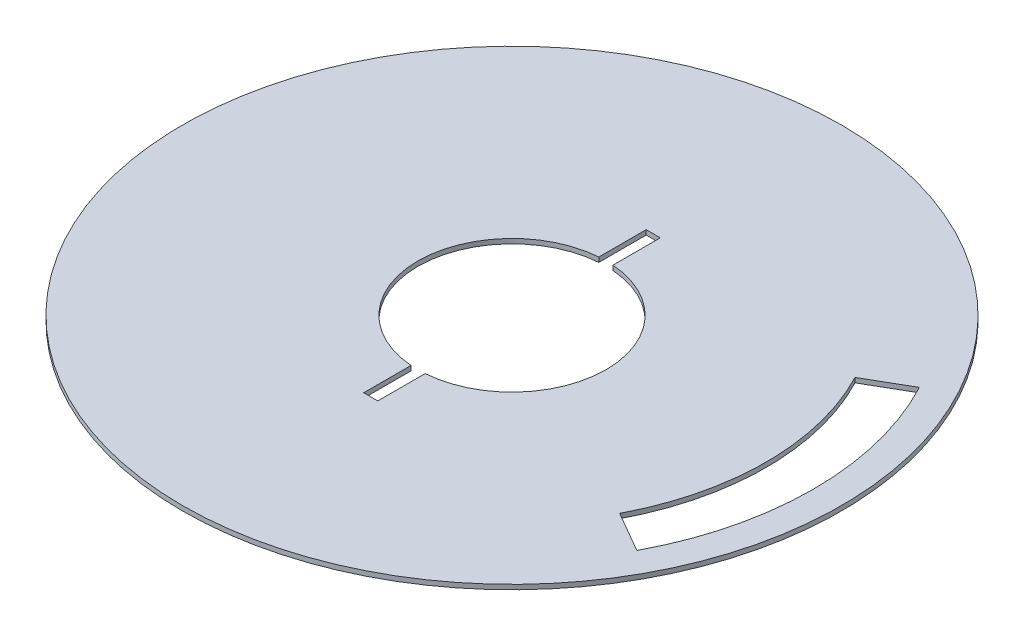
ISO-10303-21;
HEADER;
FILE_DESCRIPTION(('STEP AP214'),'2;1');
FILE_NAME('part.step','',(''),(''),'','','');
FILE_SCHEMA(('AUTOMOTIVE_DESIGN { 1 0 10303 214 1 1 1 1 }'));
ENDSEC;
DATA;
#1=APPLICATION_CONTEXT('core data for automotive mechanical design processes');
#2=APPLICATION_PROTOCOL_DEFINITION('international standard','automotive_design',2000,#1);
#3=PRODUCT_CONTEXT('',#1,'mechanical');
#4=PRODUCT('Part','Part','',(#3));
#5=PRODUCT_RELATED_PRODUCT_CATEGORY('part','',(#4));
#6=PRODUCT_DEFINITION_FORMATION('','',#4);
#7=PRODUCT_DEFINITION_CONTEXT('part definition',#1,'design');
#8=PRODUCT_DEFINITION('design','',#6,#7);
#9=PRODUCT_DEFINITION_SHAPE('','',#8);
#10=(LENGTH_UNIT() NAMED_UNIT(*) SI_UNIT(.MILLI.,.METRE.));
#11=(NAMED_UNIT(*) PLANE_ANGLE_UNIT() SI_UNIT($,.RADIAN.));
#12=(NAMED_UNIT(*) SI_UNIT($,.STERADIAN.) SOLID_ANGLE_UNIT());
#13=UNCERTAINTY_MEASURE_WITH_UNIT(LENGTH_MEASURE(1.E-05),#10,'distance_accuracy_value','');
#14=(GEOMETRIC_REPRESENTATION_CONTEXT(3) GLOBAL_UNCERTAINTY_ASSIGNED_CONTEXT((#13)) GLOBAL_UNIT_ASSIGNED_CONTEXT((#10,
#11,#12)) REPRESENTATION_CONTEXT('',''));
#15=CARTESIAN_POINT('',(0.,0.,0.));
#16=DIRECTION('',(0.,0.,1.));
#17=DIRECTION('',(1.,0.,0.));
#18=AXIS2_PLACEMENT_3D('',#15,#16,#17);
#19=CARTESIAN_POINT('',(0.,5.,0.));
#20=DIRECTION('',(0.,-1.,0.));
#21=DIRECTION('',(0.,0.,-1.));
#22=AXIS2_PLACEMENT_3D('',#19,#20,#21);
#23=CYLINDRICAL_SURFACE('',#22,270.);
#24=CARTESIAN_POINT('',(0.,0.,0.));
#25=DIRECTION('',(0.,1.,0.));
#26=DIRECTION('',(0.,0.,1.));
#27=AXIS2_PLACEMENT_3D('',#24,#25,#26);
#28=CIRCLE('',#27,270.);
#29=CARTESIAN_POINT('',(239.321958875486,0.,-125.));
#30=VERTEX_POINT('',#29);
#31=CARTESIAN_POINT('',(239.321958875486,0.,125.));
#32=VERTEX_POINT('',#31);
#33=EDGE_CURVE('E185',#30,#32,#28,.F.);
#34=ORIENTED_EDGE('',*,*,#33,.F.);
#35=DIRECTION('',(0.,-1.,0.));
#36=VECTOR('',#35,1.);
#37=CARTESIAN_POINT('',(239.321958875486,5.,-125.));
#38=LINE('',#37,#36);
#39=CARTESIAN_POINT('',(239.321958875486,5.,-125.));
#40=VERTEX_POINT('',#39);
#41=EDGE_CURVE('E11',#40,#30,#38,.T.);
#42=ORIENTED_EDGE('',*,*,#41,.F.);
#43=CARTESIAN_POINT('',(0.,5.,0.));
#44=DIRECTION('',(0.,1.,0.));
#45=DIRECTION('',(0.,0.,1.));
#46=AXIS2_PLACEMENT_3D('',#43,#44,#45);
#47=CIRCLE('',#46,270.);
#48=CARTESIAN_POINT('',(239.321958875486,5.,125.));
#49=VERTEX_POINT('',#48);
#50=EDGE_CURVE('E143',#40,#49,#47,.F.);
#51=ORIENTED_EDGE('',*,*,#50,.T.);
#52=DIRECTION('',(0.,-1.,0.));
#53=VECTOR('',#52,1.);
#54=CARTESIAN_POINT('',(239.321958875486,5.,125.));
#55=LINE('',#54,#53);
#56=EDGE_CURVE('E52',#49,#32,#55,.T.);
#57=ORIENTED_EDGE('',*,*,#56,.T.);
#58=EDGE_LOOP('',(#34,#42,#51,#57));
#59=FACE_BOUND('',#58,.T.);
#60=ADVANCED_FACE('F33',(#59),#23,.T.);
#61=CARTESIAN_POINT('',(5.7039019823442,5.,9.879448034813));
#62=DIRECTION('',(-0.5,0.,-0.866025403784439));
#63=DIRECTION('',(-0.866025403784439,0.,0.5));
#64=AXIS2_PLACEMENT_3D('',#61,#62,#63);
#65=PLANE('',#64);
#66=DIRECTION('',(0.866025403784439,0.,-0.5));
#67=VECTOR('',#66,1.);
#68=CARTESIAN_POINT('',(5.7039019823442,0.,9.879448034813));
#69=LINE('',#68,#67);
#70=CARTESIAN_POINT('',(282.655877072842,0.,-150.018849336284));
#71=VERTEX_POINT('',#70);
#72=EDGE_CURVE('E148',#30,#71,#69,.T.);
#73=ORIENTED_EDGE('',*,*,#72,.T.);
#74=DIRECTION('',(0.,-1.,0.));
#75=VECTOR('',#74,1.);
#76=CARTESIAN_POINT('',(282.655877072842,5.,-150.018849336284));
#77=LINE('',#76,#75);
#78=CARTESIAN_POINT('',(282.655877072842,5.,-150.018849336284));
#79=VERTEX_POINT('',#78);
#80=EDGE_CURVE('E43',#79,#71,#77,.T.);
#81=ORIENTED_EDGE('',*,*,#80,.F.);
#82=DIRECTION('',(0.866025403784439,0.,-0.5));
#83=VECTOR('',#82,1.);
#84=CARTESIAN_POINT('',(5.7039019823442,5.,9.879448034813));
#85=LINE('',#84,#83);
#86=EDGE_CURVE('E137',#40,#79,#85,.T.);
#87=ORIENTED_EDGE('',*,*,#86,.F.);
#88=ORIENTED_EDGE('',*,*,#41,.T.);
#89=EDGE_LOOP('',(#73,#81,#87,#88));
#90=FACE_BOUND('',#89,.T.);
#91=ADVANCED_FACE('F146',(#90),#65,.F.);
#92=CARTESIAN_POINT('',(0.,5.,0.));
#93=DIRECTION('',(0.,-1.,0.));
#94=DIRECTION('',(0.,0.,-1.));
#95=AXIS2_PLACEMENT_3D('',#92,#93,#94);
#96=CYLINDRICAL_SURFACE('',#95,320.);
#97=CARTESIAN_POINT('',(0.,0.,0.));
#98=DIRECTION('',(0.,1.,0.));
#99=DIRECTION('',(0.,0.,1.));
#100=AXIS2_PLACEMENT_3D('',#97,#98,#99);
#101=CIRCLE('',#100,320.);
#102=CARTESIAN_POINT('',(282.655877072841,0.,150.018849336284));
#103=VERTEX_POINT('',#102);
#104=EDGE_CURVE('E182',#71,#103,#101,.F.);
#105=ORIENTED_EDGE('',*,*,#104,.T.);
#106=DIRECTION('',(0.,-1.,0.));
#107=VECTOR('',#106,1.);
#108=CARTESIAN_POINT('',(282.655877072841,5.,150.018849336284));
#109=LINE('',#108,#107);
#110=CARTESIAN_POINT('',(282.655877072841,5.,150.018849336284));
#111=VERTEX_POINT('',#110);
#112=EDGE_CURVE('E90',#111,#103,#109,.T.);
#113=ORIENTED_EDGE('',*,*,#112,.F.);
#114=CARTESIAN_POINT('',(0.,5.,0.));
#115=DIRECTION('',(0.,1.,0.));
#116=DIRECTION('',(0.,0.,1.));
#117=AXIS2_PLACEMENT_3D('',#114,#115,#116);
#118=CIRCLE('',#117,320.);
#119=EDGE_CURVE('E129',#79,#111,#118,.F.);
#120=ORIENTED_EDGE('',*,*,#119,.F.);
#121=ORIENTED_EDGE('',*,*,#80,.T.);
#122=EDGE_LOOP('',(#105,#113,#120,#121));
#123=FACE_BOUND('',#122,.T.);
#124=ADVANCED_FACE('F131',(#123),#96,.F.);
#125=CARTESIAN_POINT('',(0.,5.,0.));
#126=DIRECTION('',(0.,-1.,0.));
#127=DIRECTION('',(0.,0.,-1.));
#128=AXIS2_PLACEMENT_3D('',#125,#126,#127);
#129=CYLINDRICAL_SURFACE('',#128,100.);
#130=CARTESIAN_POINT('',(0.,0.,0.));
#131=DIRECTION('',(0.,1.,0.));
#132=DIRECTION('',(0.,0.,1.));
#133=AXIS2_PLACEMENT_3D('',#130,#131,#132);
#134=CIRCLE('',#133,100.);
#135=CARTESIAN_POINT('',(7.50000000000001,0.,99.7183533758957));
#136=VERTEX_POINT('',#135);
#137=CARTESIAN_POINT('',(7.50000000000069,0.,-99.7183533758956));
#138=VERTEX_POINT('',#137);
#139=EDGE_CURVE('E206',#136,#138,#134,.T.);
#140=ORIENTED_EDGE('',*,*,#139,.F.);
#141=DIRECTION('',(0.,-1.,0.));
#142=VECTOR('',#141,1.);
#143=CARTESIAN_POINT('',(7.50000000000001,5.,99.7183533758957));
#144=LINE('',#143,#142);
#145=CARTESIAN_POINT('',(7.50000000000001,5.,99.7183533758957));
#146=VERTEX_POINT('',#145);
#147=EDGE_CURVE('E37',#146,#136,#144,.T.);
#148=ORIENTED_EDGE('',*,*,#147,.F.);
#149=CARTESIAN_POINT('',(0.,5.,0.));
#150=DIRECTION('',(0.,1.,0.));
#151=DIRECTION('',(0.,0.,1.));
#152=AXIS2_PLACEMENT_3D('',#149,#150,#151);
#153=CIRCLE('',#152,100.);
#154=CARTESIAN_POINT('',(7.50000000000069,5.,-99.7183533758956));
#155=VERTEX_POINT('',#154);
#156=EDGE_CURVE('E178',#146,#155,#153,.T.);
#157=ORIENTED_EDGE('',*,*,#156,.T.);
#158=DIRECTION('',(0.,-1.,0.));
#159=VECTOR('',#158,1.);
#160=CARTESIAN_POINT('',(7.50000000000069,5.,-99.7183533758956));
#161=LINE('',#160,#159);
#162=EDGE_CURVE('E153',#155,#138,#161,.T.);
#163=ORIENTED_EDGE('',*,*,#162,.T.);
#164=EDGE_LOOP('',(#140,#148,#157,#163));
#165=FACE_BOUND('',#164,.T.);
#166=ADVANCED_FACE('F35',(#165),#129,.F.);
#167=CARTESIAN_POINT('',(7.50000000000001,5.,0.));
#168=DIRECTION('',(-1.,0.,0.));
#169=DIRECTION('',(0.,0.,1.));
#170=AXIS2_PLACEMENT_3D('',#167,#168,#169);
#171=PLANE('',#170);
#172=DIRECTION('',(0.,0.,-1.));
#173=VECTOR('',#172,1.);
#174=CARTESIAN_POINT('',(7.50000000000001,0.,0.));
#175=LINE('',#174,#173);
#176=CARTESIAN_POINT('',(7.50000000000001,0.,150.));
#177=VERTEX_POINT('',#176);
#178=EDGE_CURVE('E203',#177,#136,#175,.T.);
#179=ORIENTED_EDGE('',*,*,#178,.F.);
#180=DIRECTION('',(0.,-1.,0.));
#181=VECTOR('',#180,1.);
#182=CARTESIAN_POINT('',(7.50000000000001,5.,150.));
#183=LINE('',#182,#181);
#184=CARTESIAN_POINT('',(7.50000000000001,5.,150.));
#185=VERTEX_POINT('',#184);
#186=EDGE_CURVE('E167',#185,#177,#183,.T.);
#187=ORIENTED_EDGE('',*,*,#186,.F.);
#188=DIRECTION('',(0.,0.,-1.));
#189=VECTOR('',#188,1.);
#190=CARTESIAN_POINT('',(7.50000000000001,5.,0.));
#191=LINE('',#190,#189);
#192=EDGE_CURVE('E227',#185,#146,#191,.T.);
#193=ORIENTED_EDGE('',*,*,#192,.T.);
#194=ORIENTED_EDGE('',*,*,#147,.T.);
#195=EDGE_LOOP('',(#179,#187,#193,#194));
#196=FACE_BOUND('',#195,.T.);
#197=ADVANCED_FACE('F233',(#196),#171,.T.);
#198=CARTESIAN_POINT('',(0.,5.,150.));
#199=DIRECTION('',(0.,0.,1.));
#200=DIRECTION('',(1.,0.,0.));
#201=AXIS2_PLACEMENT_3D('',#198,#199,#200);
#202=PLANE('',#201);
#203=DIRECTION('',(-1.,0.,0.));
#204=VECTOR('',#203,1.);
#205=CARTESIAN_POINT('',(0.,0.,150.));
#206=LINE('',#205,#204);
#207=CARTESIAN_POINT('',(-7.49999999999999,0.,150.));
#208=VERTEX_POINT('',#207);
#209=EDGE_CURVE('E201',#177,#208,#206,.T.);
#210=ORIENTED_EDGE('',*,*,#209,.T.);
#211=DIRECTION('',(0.,-1.,0.));
#212=VECTOR('',#211,1.);
#213=CARTESIAN_POINT('',(-7.49999999999999,5.,150.));
#214=LINE('',#213,#212);
#215=CARTESIAN_POINT('',(-7.49999999999999,5.,150.));
#216=VERTEX_POINT('',#215);
#217=EDGE_CURVE('E165',#216,#208,#214,.T.);
#218=ORIENTED_EDGE('',*,*,#217,.F.);
#219=DIRECTION('',(-1.,0.,0.));
#220=VECTOR('',#219,1.);
#221=CARTESIAN_POINT('',(0.,5.,150.));
#222=LINE('',#221,#220);
#223=EDGE_CURVE('E225',#185,#216,#222,.T.);
#224=ORIENTED_EDGE('',*,*,#223,.F.);
#225=ORIENTED_EDGE('',*,*,#186,.T.);
#226=EDGE_LOOP('',(#210,#218,#224,#225));
#227=FACE_BOUND('',#226,.T.);
#228=ADVANCED_FACE('F235',(#227),#202,.F.);
#229=CARTESIAN_POINT('',(-7.49999999999999,5.,0.));
#230=DIRECTION('',(-1.,0.,0.));
#231=DIRECTION('',(0.,0.,1.));
#232=AXIS2_PLACEMENT_3D('',#229,#230,#231);
#233=PLANE('',#232);
#234=DIRECTION('',(0.,0.,-1.));
#235=VECTOR('',#234,1.);
#236=CARTESIAN_POINT('',(-7.49999999999999,0.,0.));
#237=LINE('',#236,#235);
#238=CARTESIAN_POINT('',(-7.49999999999999,0.,99.7183533758957));
#239=VERTEX_POINT('',#238);
#240=EDGE_CURVE('E198',#208,#239,#237,.T.);
#241=ORIENTED_EDGE('',*,*,#240,.T.);
#242=DIRECTION('',(0.,-1.,0.));
#243=VECTOR('',#242,1.);
#244=CARTESIAN_POINT('',(-7.49999999999999,5.,99.7183533758957));
#245=LINE('',#244,#243);
#246=CARTESIAN_POINT('',(-7.49999999999999,5.,99.7183533758957));
#247=VERTEX_POINT('',#246);
#248=EDGE_CURVE('E163',#247,#239,#245,.T.);
#249=ORIENTED_EDGE('',*,*,#248,.F.);
#250=DIRECTION('',(0.,0.,-1.));
#251=VECTOR('',#250,1.);
#252=CARTESIAN_POINT('',(-7.49999999999999,5.,0.));
#253=LINE('',#252,#251);
#254=EDGE_CURVE('E223',#216,#247,#253,.T.);
#255=ORIENTED_EDGE('',*,*,#254,.F.);
#256=ORIENTED_EDGE('',*,*,#217,.T.);
#257=EDGE_LOOP('',(#241,#249,#255,#256));
#258=FACE_BOUND('',#257,.T.);
#259=ADVANCED_FACE('F241',(#258),#233,.F.);
#260=CARTESIAN_POINT('',(0.,5.,0.));
#261=DIRECTION('',(0.,-1.,0.));
#262=DIRECTION('',(0.,0.,-1.));
#263=AXIS2_PLACEMENT_3D('',#260,#261,#262);
#264=CYLINDRICAL_SURFACE('',#263,100.);
#265=CARTESIAN_POINT('',(0.,0.,0.));
#266=DIRECTION('',(0.,1.,0.));
#267=DIRECTION('',(0.,0.,1.));
#268=AXIS2_PLACEMENT_3D('',#265,#266,#267);
#269=CIRCLE('',#268,100.);
#270=CARTESIAN_POINT('',(-7.49999999999931,0.,-99.7183533758957));
#271=VERTEX_POINT('',#270);
#272=EDGE_CURVE('E195',#271,#239,#269,.T.);
#273=ORIENTED_EDGE('',*,*,#272,.F.);
#274=DIRECTION('',(0.,-1.,0.));
#275=VECTOR('',#274,1.);
#276=CARTESIAN_POINT('',(-7.49999999999931,5.,-99.7183533758957));
#277=LINE('',#276,#275);
#278=CARTESIAN_POINT('',(-7.49999999999931,5.,-99.7183533758957));
#279=VERTEX_POINT('',#278);
#280=EDGE_CURVE('E161',#279,#271,#277,.T.);
#281=ORIENTED_EDGE('',*,*,#280,.F.);
#282=CARTESIAN_POINT('',(0.,5.,0.));
#283=DIRECTION('',(0.,1.,0.));
#284=DIRECTION('',(0.,0.,1.));
#285=AXIS2_PLACEMENT_3D('',#282,#283,#284);
#286=CIRCLE('',#285,100.);
#287=EDGE_CURVE('E220',#279,#247,#286,.T.);
#288=ORIENTED_EDGE('',*,*,#287,.T.);
#289=ORIENTED_EDGE('',*,*,#248,.T.);
#290=EDGE_LOOP('',(#273,#281,#288,#289));
#291=FACE_BOUND('',#290,.T.);
#292=ADVANCED_FACE('F245',(#291),#264,.F.);
#293=CARTESIAN_POINT('',(-7.50000000000001,5.,0.));
#294=DIRECTION('',(1.,0.,0.));
#295=DIRECTION('',(0.,0.,-1.));
#296=AXIS2_PLACEMENT_3D('',#293,#294,#295);
#297=PLANE('',#296);
#298=DIRECTION('',(0.,0.,1.));
#299=VECTOR('',#298,1.);
#300=CARTESIAN_POINT('',(-7.50000000000001,0.,0.));
#301=LINE('',#300,#299);
#302=CARTESIAN_POINT('',(-7.49999999999896,0.,-150.));
#303=VERTEX_POINT('',#302);
#304=EDGE_CURVE('E192',#303,#271,#301,.T.);
#305=ORIENTED_EDGE('',*,*,#304,.F.);
#306=DIRECTION('',(0.,-1.,0.));
#307=VECTOR('',#306,1.);
#308=CARTESIAN_POINT('',(-7.49999999999896,5.,-150.));
#309=LINE('',#308,#307);
#310=CARTESIAN_POINT('',(-7.49999999999896,5.,-150.));
#311=VERTEX_POINT('',#310);
#312=EDGE_CURVE('E159',#311,#303,#309,.T.);
#313=ORIENTED_EDGE('',*,*,#312,.F.);
#314=DIRECTION('',(0.,0.,1.));
#315=VECTOR('',#314,1.);
#316=CARTESIAN_POINT('',(-7.50000000000001,5.,0.));
#317=LINE('',#316,#315);
#318=EDGE_CURVE('E217',#311,#279,#317,.T.);
#319=ORIENTED_EDGE('',*,*,#318,.T.);
#320=ORIENTED_EDGE('',*,*,#280,.T.);
#321=EDGE_LOOP('',(#305,#313,#319,#320));
#322=FACE_BOUND('',#321,.T.);
#323=ADVANCED_FACE('F248',(#322),#297,.T.);
#324=CARTESIAN_POINT('',(1.11022302462516E-12,5.,-150.));
#325=DIRECTION('',(0.,0.,-1.));
#326=DIRECTION('',(-1.,0.,0.));
#327=AXIS2_PLACEMENT_3D('',#324,#325,#326);
#328=PLANE('',#327);
#329=DIRECTION('',(1.,0.,0.));
#330=VECTOR('',#329,1.);
#331=CARTESIAN_POINT('',(1.11022302462516E-12,0.,-150.));
#332=LINE('',#331,#330);
#333=CARTESIAN_POINT('',(7.50000000000104,0.,-150.));
#334=VERTEX_POINT('',#333);
#335=EDGE_CURVE('E190',#303,#334,#332,.T.);
#336=ORIENTED_EDGE('',*,*,#335,.T.);
#337=DIRECTION('',(0.,-1.,0.));
#338=VECTOR('',#337,1.);
#339=CARTESIAN_POINT('',(7.50000000000104,5.,-150.));
#340=LINE('',#339,#338);
#341=CARTESIAN_POINT('',(7.50000000000104,5.,-150.));
#342=VERTEX_POINT('',#341);
#343=EDGE_CURVE('E155',#342,#334,#340,.T.);
#344=ORIENTED_EDGE('',*,*,#343,.F.);
#345=DIRECTION('',(1.,0.,0.));
#346=VECTOR('',#345,1.);
#347=CARTESIAN_POINT('',(1.11022302462516E-12,5.,-150.));
#348=LINE('',#347,#346);
#349=EDGE_CURVE('E215',#311,#342,#348,.T.);
#350=ORIENTED_EDGE('',*,*,#349,.F.);
#351=ORIENTED_EDGE('',*,*,#312,.T.);
#352=EDGE_LOOP('',(#336,#344,#350,#351));
#353=FACE_BOUND('',#352,.T.);
#354=ADVANCED_FACE('F252',(#353),#328,.F.);
#355=CARTESIAN_POINT('',(5.70390198234451,5.,-9.87944803481348));
#356=DIRECTION('',(0.500000000000002,0.,-0.866025403784438));
#357=DIRECTION('',(-0.866025403784438,0.,-0.500000000000002));
#358=AXIS2_PLACEMENT_3D('',#355,#356,#357);
#359=PLANE('',#358);
#360=DIRECTION('',(0.866025403784438,0.,0.500000000000002));
#361=VECTOR('',#360,1.);
#362=CARTESIAN_POINT('',(5.70390198234451,0.,-9.87944803481348));
#363=LINE('',#362,#361);
#364=EDGE_CURVE('E179',#32,#103,#363,.T.);
#365=ORIENTED_EDGE('',*,*,#364,.F.);
#366=ORIENTED_EDGE('',*,*,#56,.F.);
#367=DIRECTION('',(0.866025403784438,0.,0.500000000000002));
#368=VECTOR('',#367,1.);
#369=CARTESIAN_POINT('',(5.70390198234451,5.,-9.87944803481348));
#370=LINE('',#369,#368);
#371=EDGE_CURVE('E136',#49,#111,#370,.T.);
#372=ORIENTED_EDGE('',*,*,#371,.T.);
#373=ORIENTED_EDGE('',*,*,#112,.T.);
#374=EDGE_LOOP('',(#365,#366,#372,#373));
#375=FACE_BOUND('',#374,.T.);
#376=ADVANCED_FACE('F274',(#375),#359,.T.);
#377=CARTESIAN_POINT('',(7.49999999999999,5.,0.));
#378=DIRECTION('',(1.,0.,0.));
#379=DIRECTION('',(0.,0.,-1.));
#380=AXIS2_PLACEMENT_3D('',#377,#378,#379);
#381=PLANE('',#380);
#382=DIRECTION('',(0.,0.,1.));
#383=VECTOR('',#382,1.);
#384=CARTESIAN_POINT('',(7.49999999999999,0.,0.));
#385=LINE('',#384,#383);
#386=EDGE_CURVE('E187',#334,#138,#385,.T.);
#387=ORIENTED_EDGE('',*,*,#386,.T.);
#388=ORIENTED_EDGE('',*,*,#162,.F.);
#389=DIRECTION('',(0.,0.,1.));
#390=VECTOR('',#389,1.);
#391=CARTESIAN_POINT('',(7.49999999999999,5.,0.));
#392=LINE('',#391,#390);
#393=EDGE_CURVE('E213',#342,#155,#392,.T.);
#394=ORIENTED_EDGE('',*,*,#393,.F.);
#395=ORIENTED_EDGE('',*,*,#343,.T.);
#396=EDGE_LOOP('',(#387,#388,#394,#395));
#397=FACE_BOUND('',#396,.T.);
#398=ADVANCED_FACE('F256',(#397),#381,.F.);
#399=CARTESIAN_POINT('',(0.,5.,0.));
#400=DIRECTION('',(0.,-1.,0.));
#401=DIRECTION('',(0.,0.,-1.));
#402=AXIS2_PLACEMENT_3D('',#399,#400,#401);
#403=CYLINDRICAL_SURFACE('',#402,350.);
#404=CARTESIAN_POINT('',(0.,5.,0.));
#405=DIRECTION('',(0.,1.,0.));
#406=DIRECTION('',(0.,0.,1.));
#407=AXIS2_PLACEMENT_3D('',#404,#405,#406);
#408=CIRCLE('',#407,350.);
#409=CARTESIAN_POINT('',(0.,5.,350.));
#410=VERTEX_POINT('',#409);
#411=EDGE_CURVE('E156',#410,#410,#408,.T.);
#412=ORIENTED_EDGE('',*,*,#411,.F.);
#413=EDGE_LOOP('',(#412));
#414=FACE_BOUND('',#413,.T.);
#415=CARTESIAN_POINT('',(0.,0.,0.));
#416=DIRECTION('',(0.,1.,0.));
#417=DIRECTION('',(0.,0.,1.));
#418=AXIS2_PLACEMENT_3D('',#415,#416,#417);
#419=CIRCLE('',#418,350.);
#420=CARTESIAN_POINT('',(0.,0.,350.));
#421=VERTEX_POINT('',#420);
#422=EDGE_CURVE('E175',#421,#421,#419,.T.);
#423=ORIENTED_EDGE('',*,*,#422,.T.);
#424=EDGE_LOOP('',(#423));
#425=FACE_BOUND('',#424,.T.);
#426=ADVANCED_FACE('F265',(#414,#425),#403,.T.);
#427=CARTESIAN_POINT('',(0.,5.,0.));
#428=DIRECTION('',(0.,1.,0.));
#429=DIRECTION('',(0.,0.,1.));
#430=AXIS2_PLACEMENT_3D('',#427,#428,#429);
#431=PLANE('',#430);
#432=ORIENTED_EDGE('',*,*,#156,.F.);
#433=ORIENTED_EDGE('',*,*,#192,.F.);
#434=ORIENTED_EDGE('',*,*,#223,.T.);
#435=ORIENTED_EDGE('',*,*,#254,.T.);
#436=ORIENTED_EDGE('',*,*,#287,.F.);
#437=ORIENTED_EDGE('',*,*,#318,.F.);
#438=ORIENTED_EDGE('',*,*,#349,.T.);
#439=ORIENTED_EDGE('',*,*,#393,.T.);
#440=EDGE_LOOP('',(#432,#433,#434,#435,#436,#437,#438,#439));
#441=FACE_BOUND('',#440,.T.);
#442=ORIENTED_EDGE('',*,*,#50,.F.);
#443=ORIENTED_EDGE('',*,*,#86,.T.);
#444=ORIENTED_EDGE('',*,*,#119,.T.);
#445=ORIENTED_EDGE('',*,*,#371,.F.);
#446=EDGE_LOOP('',(#442,#443,#444,#445));
#447=FACE_BOUND('',#446,.T.);
#448=ORIENTED_EDGE('',*,*,#411,.T.);
#449=EDGE_LOOP('',(#448));
#450=FACE_BOUND('',#449,.T.);
#451=ADVANCED_FACE('F141',(#441,#447,#450),#431,.T.);
#452=CARTESIAN_POINT('',(0.,0.,0.));
#453=DIRECTION('',(0.,1.,0.));
#454=DIRECTION('',(0.,0.,1.));
#455=AXIS2_PLACEMENT_3D('',#452,#453,#454);
#456=PLANE('',#455);
#457=ORIENTED_EDGE('',*,*,#139,.T.);
#458=ORIENTED_EDGE('',*,*,#386,.F.);
#459=ORIENTED_EDGE('',*,*,#335,.F.);
#460=ORIENTED_EDGE('',*,*,#304,.T.);
#461=ORIENTED_EDGE('',*,*,#272,.T.);
#462=ORIENTED_EDGE('',*,*,#240,.F.);
#463=ORIENTED_EDGE('',*,*,#209,.F.);
#464=ORIENTED_EDGE('',*,*,#178,.T.);
#465=EDGE_LOOP('',(#457,#458,#459,#460,#461,#462,#463,#464));
#466=FACE_BOUND('',#465,.T.);
#467=ORIENTED_EDGE('',*,*,#33,.T.);
#468=ORIENTED_EDGE('',*,*,#364,.T.);
#469=ORIENTED_EDGE('',*,*,#104,.F.);
#470=ORIENTED_EDGE('',*,*,#72,.F.);
#471=EDGE_LOOP('',(#467,#468,#469,#470));
#472=FACE_BOUND('',#471,.T.);
#473=ORIENTED_EDGE('',*,*,#422,.F.);
#474=EDGE_LOOP('',(#473));
#475=FACE_BOUND('',#474,.T.);
#476=ADVANCED_FACE('F258',(#466,#472,#475),#456,.F.);
#477=CLOSED_SHELL('',(#60,#91,#124,#166,#197,#228,#259,#292,#323,#354,#376,#398,#426,#451,#476));
#478=MANIFOLD_SOLID_BREP('B2',#477);
#479=ADVANCED_BREP_SHAPE_REPRESENTATION('',(#18,#478),#14);
#480=SHAPE_DEFINITION_REPRESENTATION(#9,#479);
ENDSEC;
END-ISO-10303-21;
